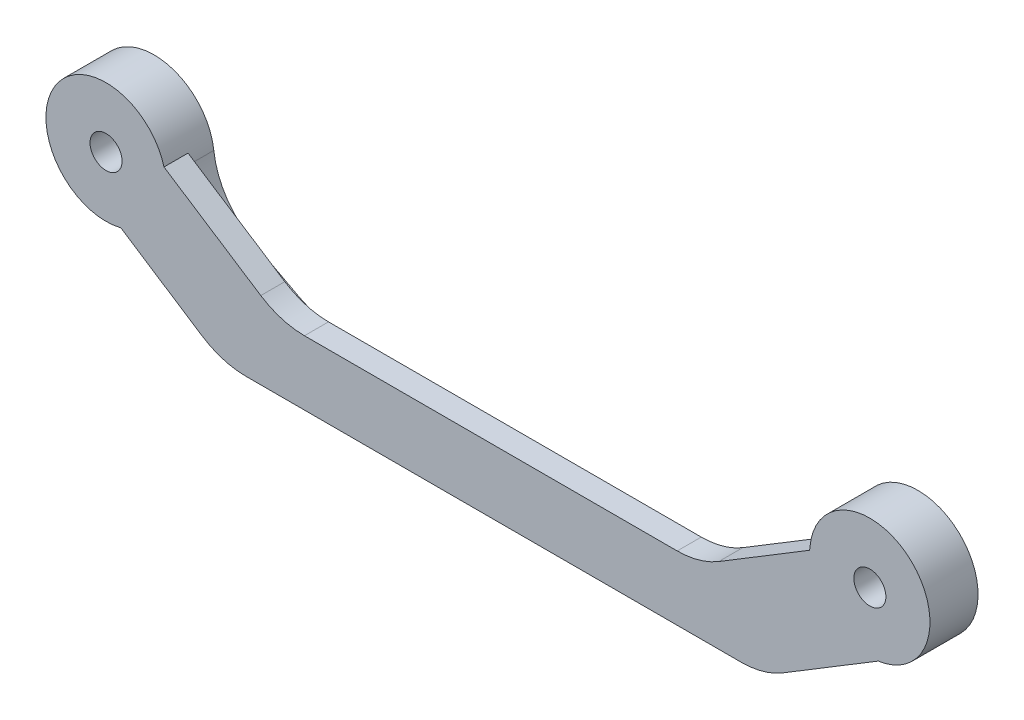
ISO-10303-21;
HEADER;
FILE_DESCRIPTION(('STEP AP214'),'2;1');
FILE_NAME('part.step','',(''),(''),'','','');
FILE_SCHEMA(('AUTOMOTIVE_DESIGN { 1 0 10303 214 1 1 1 1 }'));
ENDSEC;
DATA;
#1=APPLICATION_CONTEXT('core data for automotive mechanical design processes');
#2=APPLICATION_PROTOCOL_DEFINITION('international standard','automotive_design',2000,#1);
#3=PRODUCT_CONTEXT('',#1,'mechanical');
#4=PRODUCT('Part','Part','',(#3));
#5=PRODUCT_RELATED_PRODUCT_CATEGORY('part','',(#4));
#6=PRODUCT_DEFINITION_FORMATION('','',#4);
#7=PRODUCT_DEFINITION_CONTEXT('part definition',#1,'design');
#8=PRODUCT_DEFINITION('design','',#6,#7);
#9=PRODUCT_DEFINITION_SHAPE('','',#8);
#10=(LENGTH_UNIT() NAMED_UNIT(*) SI_UNIT(.MILLI.,.METRE.));
#11=(NAMED_UNIT(*) PLANE_ANGLE_UNIT() SI_UNIT($,.RADIAN.));
#12=(NAMED_UNIT(*) SI_UNIT($,.STERADIAN.) SOLID_ANGLE_UNIT());
#13=UNCERTAINTY_MEASURE_WITH_UNIT(LENGTH_MEASURE(1.E-05),#10,'distance_accuracy_value','');
#14=(GEOMETRIC_REPRESENTATION_CONTEXT(3) GLOBAL_UNCERTAINTY_ASSIGNED_CONTEXT((#13)) GLOBAL_UNIT_ASSIGNED_CONTEXT((#10,
#11,#12)) REPRESENTATION_CONTEXT('',''));
#15=CARTESIAN_POINT('',(0.,0.,0.));
#16=DIRECTION('',(0.,0.,1.));
#17=DIRECTION('',(1.,0.,0.));
#18=AXIS2_PLACEMENT_3D('',#15,#16,#17);
#19=CARTESIAN_POINT('',(0.,0.,0.));
#20=DIRECTION('',(0.,0.,1.));
#21=DIRECTION('',(1.,0.,0.));
#22=AXIS2_PLACEMENT_3D('',#19,#20,#21);
#23=PLANE('',#22);
#24=DIRECTION('',(-1.,0.,0.));
#25=VECTOR('',#24,1.);
#26=CARTESIAN_POINT('',(0.,-10.798154811245,0.));
#27=LINE('',#26,#25);
#28=CARTESIAN_POINT('',(72.4325503863458,-10.798154811245,0.));
#29=VERTEX_POINT('',#28);
#30=CARTESIAN_POINT('',(22.8152381583089,-10.798154811245,0.));
#31=VERTEX_POINT('',#30);
#32=EDGE_CURVE('E573',#29,#31,#27,.T.);
#33=ORIENTED_EDGE('',*,*,#32,.T.);
#34=CARTESIAN_POINT('',(22.8152381583089,-0.798154811245044,0.));
#35=DIRECTION('',(0.,0.,1.));
#36=DIRECTION('',(1.,0.,0.));
#37=AXIS2_PLACEMENT_3D('',#34,#35,#36);
#38=CIRCLE('',#37,10.);
#39=CARTESIAN_POINT('',(18.1232664163556,-9.62908914305338,0.));
#40=VERTEX_POINT('',#39);
#41=EDGE_CURVE('E387',#31,#40,#38,.F.);
#42=ORIENTED_EDGE('',*,*,#41,.T.);
#43=DIRECTION('',(-0.883093433180833,0.469197174195337,0.));
#44=VECTOR('',#43,1.);
#45=CARTESIAN_POINT('',(0.,0.,0.));
#46=LINE('',#45,#44);
#47=CARTESIAN_POINT('',(12.6824638741341,-6.73833140185933,0.));
#48=VERTEX_POINT('',#47);
#49=EDGE_CURVE('E567',#40,#48,#46,.T.);
#50=ORIENTED_EDGE('',*,*,#49,.T.);
#51=CARTESIAN_POINT('',(17.3744356160875,2.092602929949,0.));
#52=DIRECTION('',(0.,0.,1.));
#53=DIRECTION('',(1.,0.,0.));
#54=AXIS2_PLACEMENT_3D('',#51,#52,#53);
#55=CIRCLE('',#54,10.);
#56=CARTESIAN_POINT('',(7.44618669260892,0.896829827120999,0.));
#57=VERTEX_POINT('',#56);
#58=EDGE_CURVE('E286',#48,#57,#55,.F.);
#59=ORIENTED_EDGE('',*,*,#58,.T.);
#60=CARTESIAN_POINT('',(0.,0.,0.));
#61=DIRECTION('',(0.,0.,-1.));
#62=DIRECTION('',(-1.,0.,0.));
#63=AXIS2_PLACEMENT_3D('',#60,#61,#62);
#64=CIRCLE('',#63,7.5);
#65=CARTESIAN_POINT('',(7.22993331964056,1.9945085092702,0.));
#66=VERTEX_POINT('',#65);
#67=EDGE_CURVE('E252',#66,#57,#64,.T.);
#68=ORIENTED_EDGE('',*,*,#67,.F.);
#69=DIRECTION('',(0.838360945886254,-0.545115514742248,0.));
#70=VECTOR('',#69,1.);
#71=CARTESIAN_POINT('',(3.05987885568128,4.7059437171941,0.));
#72=LINE('',#71,#70);
#73=CARTESIAN_POINT('',(19.307973916843,-5.85882405533506,0.));
#74=VERTEX_POINT('',#73);
#75=EDGE_CURVE('E594',#66,#74,#72,.T.);
#76=ORIENTED_EDGE('',*,*,#75,.T.);
#77=CARTESIAN_POINT('',(24.7591290642655,2.52478540352748,0.));
#78=DIRECTION('',(0.,0.,1.));
#79=DIRECTION('',(1.,0.,0.));
#80=AXIS2_PLACEMENT_3D('',#77,#78,#79);
#81=CIRCLE('',#80,10.);
#82=CARTESIAN_POINT('',(24.7591290642655,-7.47521459647252,0.));
#83=VERTEX_POINT('',#82);
#84=EDGE_CURVE('E65',#74,#83,#81,.T.);
#85=ORIENTED_EDGE('',*,*,#84,.T.);
#86=DIRECTION('',(1.,0.,0.));
#87=VECTOR('',#86,1.);
#88=CARTESIAN_POINT('',(0.,-7.47521459647252,0.));
#89=LINE('',#88,#87);
#90=CARTESIAN_POINT('',(71.2682722322192,-7.47521459647252,0.));
#91=VERTEX_POINT('',#90);
#92=EDGE_CURVE('E619',#83,#91,#89,.T.);
#93=ORIENTED_EDGE('',*,*,#92,.T.);
#94=CARTESIAN_POINT('',(71.2682722322192,2.52478540352748,0.));
#95=DIRECTION('',(0.,0.,1.));
#96=DIRECTION('',(1.,0.,0.));
#97=AXIS2_PLACEMENT_3D('',#94,#95,#96);
#98=CIRCLE('',#97,10.);
#99=CARTESIAN_POINT('',(76.4587896796708,-6.0226427843955,0.));
#100=VERTEX_POINT('',#99);
#101=EDGE_CURVE('E57',#91,#100,#98,.T.);
#102=ORIENTED_EDGE('',*,*,#101,.T.);
#103=DIRECTION('',(0.8547428187923,0.519051744745159,0.));
#104=VECTOR('',#103,1.);
#105=CARTESIAN_POINT('',(23.2711030430952,-38.3214359894447,0.));
#106=LINE('',#105,#104);
#107=CARTESIAN_POINT('',(87.7880278038112,0.857158584719514,0.));
#108=VERTEX_POINT('',#107);
#109=EDGE_CURVE('E240',#100,#108,#106,.T.);
#110=ORIENTED_EDGE('',*,*,#109,.T.);
#111=CARTESIAN_POINT('',(77.8883178999931,2.26986655887549,0.));
#112=DIRECTION('',(0.,0.,1.));
#113=DIRECTION('',(1.,0.,0.));
#114=AXIS2_PLACEMENT_3D('',#111,#112,#113);
#115=CIRCLE('',#114,10.);
#116=CARTESIAN_POINT('',(82.7899012740973,-6.44646755740901,0.));
#117=VERTEX_POINT('',#116);
#118=EDGE_CURVE('E289',#108,#117,#115,.F.);
#119=ORIENTED_EDGE('',*,*,#118,.T.);
#120=DIRECTION('',(-0.87163341162845,-0.490158337410423,0.));
#121=VECTOR('',#120,1.);
#122=CARTESIAN_POINT('',(22.644882316251,-40.2686938541482,0.));
#123=LINE('',#122,#121);
#124=CARTESIAN_POINT('',(77.33413376045,-9.51448892752954,0.));
#125=VERTEX_POINT('',#124);
#126=EDGE_CURVE('E576',#117,#125,#123,.T.);
#127=ORIENTED_EDGE('',*,*,#126,.T.);
#128=CARTESIAN_POINT('',(72.4325503863458,-0.798154811245046,0.));
#129=DIRECTION('',(0.,0.,1.));
#130=DIRECTION('',(1.,0.,0.));
#131=AXIS2_PLACEMENT_3D('',#128,#129,#130);
#132=CIRCLE('',#131,10.);
#133=EDGE_CURVE('E384',#125,#29,#132,.F.);
#134=ORIENTED_EDGE('',*,*,#133,.T.);
#135=EDGE_LOOP('',(#33,#42,#50,#59,#68,#76,#85,#93,#102,#110,#119,#127,#134));
#136=FACE_BOUND('',#135,.T.);
#137=ADVANCED_FACE('F41',(#136),#23,.F.);
#138=DIRECTION('',(1.,0.,0.));
#139=VECTOR('',#138,1.);
#140=CARTESIAN_POINT('',(0.,-15.5109065068003,0.));
#141=LINE('',#140,#139);
#142=CARTESIAN_POINT('',(17.4575347319514,-15.5109065068003,0.));
#143=VERTEX_POINT('',#142);
#144=CARTESIAN_POINT('',(79.2698009548309,-15.5109065068003,0.));
#145=VERTEX_POINT('',#144);
#146=EDGE_CURVE('E241',#143,#145,#141,.T.);
#147=ORIENTED_EDGE('',*,*,#146,.F.);
#148=CARTESIAN_POINT('',(17.4575347319514,-5.5109065068003,0.));
#149=DIRECTION('',(0.,0.,1.));
#150=DIRECTION('',(1.,0.,0.));
#151=AXIS2_PLACEMENT_3D('',#148,#149,#150);
#152=CIRCLE('',#151,10.);
#153=CARTESIAN_POINT('',(11.9980146475645,-13.8890710103283,0.));
#154=VERTEX_POINT('',#153);
#155=EDGE_CURVE('E343',#143,#154,#152,.F.);
#156=ORIENTED_EDGE('',*,*,#155,.T.);
#157=DIRECTION('',(0.837816450352802,-0.545952008438683,0.));
#158=VECTOR('',#157,1.);
#159=CARTESIAN_POINT('',(-2.7767948878628,-4.26126179654545,0.));
#160=LINE('',#159,#158);
#161=CARTESIAN_POINT('',(1.84474832803201,-7.27282930604166,0.));
#162=VERTEX_POINT('',#161);
#163=EDGE_CURVE('E585',#162,#154,#160,.T.);
#164=ORIENTED_EDGE('',*,*,#163,.F.);
#165=CARTESIAN_POINT('',(3.93053466118942,-17.052885306516,0.));
#166=DIRECTION('',(0.,0.,1.));
#167=DIRECTION('',(1.,0.,0.));
#168=AXIS2_PLACEMENT_3D('',#165,#166,#167);
#169=CIRCLE('',#168,10.);
#170=CARTESIAN_POINT('',(8.62250640314279,-8.22195097470765,0.));
#171=VERTEX_POINT('',#170);
#172=EDGE_CURVE('E271',#162,#171,#169,.F.);
#173=ORIENTED_EDGE('',*,*,#172,.T.);
#174=DIRECTION('',(0.883093433180833,-0.469197174195337,0.));
#175=VECTOR('',#174,1.);
#176=CARTESIAN_POINT('',(-1.50851361773463,-2.83922952428249,0.));
#177=LINE('',#176,#175);
#178=CARTESIAN_POINT('',(16.6147527986209,-12.4683186673359,0.));
#179=VERTEX_POINT('',#178);
#180=EDGE_CURVE('E563',#171,#179,#177,.T.);
#181=ORIENTED_EDGE('',*,*,#180,.T.);
#182=CARTESIAN_POINT('',(21.3067245405743,-3.63738433552753,0.));
#183=DIRECTION('',(0.,0.,1.));
#184=DIRECTION('',(1.,0.,0.));
#185=AXIS2_PLACEMENT_3D('',#182,#183,#184);
#186=CIRCLE('',#185,10.);
#187=CARTESIAN_POINT('',(21.3067245405743,-13.6373843355275,0.));
#188=VERTEX_POINT('',#187);
#189=EDGE_CURVE('E413',#179,#188,#186,.T.);
#190=ORIENTED_EDGE('',*,*,#189,.T.);
#191=DIRECTION('',(1.,0.,0.));
#192=VECTOR('',#191,1.);
#193=CARTESIAN_POINT('',(0.,-13.6373843355275,0.));
#194=LINE('',#193,#192);
#195=CARTESIAN_POINT('',(74.0291757618564,-13.6373843355275,0.));
#196=VERTEX_POINT('',#195);
#197=EDGE_CURVE('E559',#188,#196,#194,.T.);
#198=ORIENTED_EDGE('',*,*,#197,.T.);
#199=CARTESIAN_POINT('',(74.0291757618564,-3.63738433552753,0.));
#200=DIRECTION('',(0.,0.,1.));
#201=DIRECTION('',(1.,0.,0.));
#202=AXIS2_PLACEMENT_3D('',#199,#200,#201);
#203=CIRCLE('',#202,10.);
#204=CARTESIAN_POINT('',(78.9307591359606,-12.353718451812,0.));
#205=VERTEX_POINT('',#204);
#206=EDGE_CURVE('E410',#196,#205,#203,.T.);
#207=ORIENTED_EDGE('',*,*,#206,.T.);
#208=DIRECTION('',(0.87163341162845,0.490158337410423,0.));
#209=VECTOR('',#208,1.);
#210=CARTESIAN_POINT('',(24.2415076917617,-43.1079233784307,0.));
#211=LINE('',#210,#209);
#212=CARTESIAN_POINT('',(86.9474614092907,-7.84556926272974,0.));
#213=VERTEX_POINT('',#212);
#214=EDGE_CURVE('E556',#205,#213,#211,.T.);
#215=ORIENTED_EDGE('',*,*,#214,.T.);
#216=CARTESIAN_POINT('',(91.8490447833949,-16.5619033790142,0.));
#217=DIRECTION('',(0.,0.,1.));
#218=DIRECTION('',(1.,0.,0.));
#219=AXIS2_PLACEMENT_3D('',#216,#217,#218);
#220=CIRCLE('',#219,10.);
#221=CARTESIAN_POINT('',(93.8254666893895,-6.75916108670112,0.));
#222=VERTEX_POINT('',#221);
#223=EDGE_CURVE('E248',#213,#222,#220,.F.);
#224=ORIENTED_EDGE('',*,*,#223,.T.);
#225=CARTESIAN_POINT('',(95.3077831188855,0.592895632533732,0.));
#226=DIRECTION('',(0.,0.,-1.));
#227=DIRECTION('',(-1.,0.,0.));
#228=AXIS2_PLACEMENT_3D('',#225,#226,#227);
#229=CIRCLE('',#228,7.5);
#230=CARTESIAN_POINT('',(96.3582789784704,-6.83317051644414,0.));
#231=VERTEX_POINT('',#230);
#232=EDGE_CURVE('E244',#231,#222,#229,.T.);
#233=ORIENTED_EDGE('',*,*,#232,.F.);
#234=DIRECTION('',(0.8547428187923,0.519051744745159,0.));
#235=VECTOR('',#234,1.);
#236=CARTESIAN_POINT('',(28.9919135457597,-47.7421185019847,0.));
#237=LINE('',#236,#235);
#238=CARTESIAN_POINT('',(84.4603184022824,-14.0583346947233,0.));
#239=VERTEX_POINT('',#238);
#240=EDGE_CURVE('E229',#239,#231,#237,.T.);
#241=ORIENTED_EDGE('',*,*,#240,.F.);
#242=CARTESIAN_POINT('',(79.2698009548309,-5.5109065068003,0.));
#243=DIRECTION('',(0.,0.,1.));
#244=DIRECTION('',(1.,0.,0.));
#245=AXIS2_PLACEMENT_3D('',#242,#243,#244);
#246=CIRCLE('',#245,10.);
#247=EDGE_CURVE('E340',#239,#145,#246,.F.);
#248=ORIENTED_EDGE('',*,*,#247,.T.);
#249=EDGE_LOOP('',(#147,#156,#164,#173,#181,#190,#198,#207,#215,#224,#233,#241,#248));
#250=FACE_BOUND('',#249,.T.);
#251=ADVANCED_FACE('F246',(#250),#23,.F.);
#252=CARTESIAN_POINT('',(0.,0.,3.));
#253=DIRECTION('',(0.,0.,-1.));
#254=DIRECTION('',(-1.,0.,0.));
#255=AXIS2_PLACEMENT_3D('',#252,#253,#254);
#256=CYLINDRICAL_SURFACE('',#255,7.5);
#257=CARTESIAN_POINT('',(0.,0.,-3.));
#258=DIRECTION('',(0.,0.,-1.));
#259=DIRECTION('',(-1.,0.,0.));
#260=AXIS2_PLACEMENT_3D('',#257,#258,#259);
#261=CIRCLE('',#260,7.5);
#262=CARTESIAN_POINT('',(1.68451485479547,-7.30837941707828,-3.));
#263=VERTEX_POINT('',#262);
#264=CARTESIAN_POINT('',(7.44618669260892,0.896829827120999,-3.));
#265=VERTEX_POINT('',#264);
#266=EDGE_CURVE('E548',#263,#265,#261,.T.);
#267=ORIENTED_EDGE('',*,*,#266,.F.);
#268=DIRECTION('',(0.,0.,-1.));
#269=VECTOR('',#268,1.);
#270=CARTESIAN_POINT('',(1.68451485479547,-7.30837941707828,3.));
#271=LINE('',#270,#269);
#272=CARTESIAN_POINT('',(1.68451485479547,-7.30837941707828,3.));
#273=VERTEX_POINT('',#272);
#274=EDGE_CURVE('E298',#263,#273,#271,.F.);
#275=ORIENTED_EDGE('',*,*,#274,.T.);
#276=CARTESIAN_POINT('',(0.,0.,3.));
#277=DIRECTION('',(0.,0.,1.));
#278=DIRECTION('',(1.,0.,0.));
#279=AXIS2_PLACEMENT_3D('',#276,#277,#278);
#280=CIRCLE('',#279,7.5);
#281=CARTESIAN_POINT('',(7.22993331964056,1.9945085092702,3.));
#282=VERTEX_POINT('',#281);
#283=EDGE_CURVE('E589',#282,#273,#280,.T.);
#284=ORIENTED_EDGE('',*,*,#283,.F.);
#285=DIRECTION('',(0.,0.,-1.));
#286=VECTOR('',#285,1.);
#287=CARTESIAN_POINT('',(7.22993331964056,1.9945085092702,3.));
#288=LINE('',#287,#286);
#289=EDGE_CURVE('E259',#282,#66,#288,.T.);
#290=ORIENTED_EDGE('',*,*,#289,.T.);
#291=ORIENTED_EDGE('',*,*,#67,.T.);
#292=DIRECTION('',(0.,0.,-1.));
#293=VECTOR('',#292,1.);
#294=CARTESIAN_POINT('',(7.44618669260892,0.896829827120999,3.));
#295=LINE('',#294,#293);
#296=EDGE_CURVE('E295',#57,#265,#295,.T.);
#297=ORIENTED_EDGE('',*,*,#296,.T.);
#298=EDGE_LOOP('',(#267,#275,#284,#290,#291,#297));
#299=FACE_BOUND('',#298,.T.);
#300=ADVANCED_FACE('F457',(#299),#256,.T.);
#301=CARTESIAN_POINT('',(-2.7767948878628,-4.26126179654545,3.));
#302=DIRECTION('',(0.545952008438683,0.837816450352802,0.));
#303=DIRECTION('',(-0.837816450352802,0.545952008438683,0.));
#304=AXIS2_PLACEMENT_3D('',#301,#302,#303);
#305=PLANE('',#304);
#306=ORIENTED_EDGE('',*,*,#163,.T.);
#307=DIRECTION('',(0.,0.,-1.));
#308=VECTOR('',#307,1.);
#309=CARTESIAN_POINT('',(11.9980146475645,-13.8890710103283,3.));
#310=LINE('',#309,#308);
#311=CARTESIAN_POINT('',(11.9980146475645,-13.8890710103283,3.));
#312=VERTEX_POINT('',#311);
#313=EDGE_CURVE('E346',#154,#312,#310,.F.);
#314=ORIENTED_EDGE('',*,*,#313,.T.);
#315=DIRECTION('',(0.837816450352802,-0.545952008438683,0.));
#316=VECTOR('',#315,1.);
#317=CARTESIAN_POINT('',(-2.7767948878628,-4.26126179654545,3.));
#318=LINE('',#317,#316);
#319=CARTESIAN_POINT('',(1.84474832803201,-7.27282930604166,3.));
#320=VERTEX_POINT('',#319);
#321=EDGE_CURVE('E593',#320,#312,#318,.T.);
#322=ORIENTED_EDGE('',*,*,#321,.F.);
#323=DIRECTION('',(0.,0.,-1.));
#324=VECTOR('',#323,1.);
#325=CARTESIAN_POINT('',(1.84474832803201,-7.27282930604166,3.));
#326=LINE('',#325,#324);
#327=EDGE_CURVE('E302',#320,#162,#326,.T.);
#328=ORIENTED_EDGE('',*,*,#327,.T.);
#329=EDGE_LOOP('',(#306,#314,#322,#328));
#330=FACE_BOUND('',#329,.T.);
#331=ADVANCED_FACE('F479',(#330),#305,.F.);
#332=CARTESIAN_POINT('',(0.,-15.5109065068003,3.));
#333=DIRECTION('',(0.,1.,0.));
#334=DIRECTION('',(0.,0.,1.));
#335=AXIS2_PLACEMENT_3D('',#332,#333,#334);
#336=PLANE('',#335);
#337=DIRECTION('',(1.,0.,0.));
#338=VECTOR('',#337,1.);
#339=CARTESIAN_POINT('',(0.,-15.5109065068003,3.));
#340=LINE('',#339,#338);
#341=CARTESIAN_POINT('',(17.4575347319514,-15.5109065068003,3.));
#342=VERTEX_POINT('',#341);
#343=CARTESIAN_POINT('',(79.2698009548309,-15.5109065068003,3.));
#344=VERTEX_POINT('',#343);
#345=EDGE_CURVE('E597',#342,#344,#340,.T.);
#346=ORIENTED_EDGE('',*,*,#345,.F.);
#347=DIRECTION('',(0.,0.,-1.));
#348=VECTOR('',#347,1.);
#349=CARTESIAN_POINT('',(17.4575347319514,-15.5109065068003,3.));
#350=LINE('',#349,#348);
#351=EDGE_CURVE('E336',#342,#143,#350,.T.);
#352=ORIENTED_EDGE('',*,*,#351,.T.);
#353=ORIENTED_EDGE('',*,*,#146,.T.);
#354=DIRECTION('',(0.,0.,-1.));
#355=VECTOR('',#354,1.);
#356=CARTESIAN_POINT('',(79.2698009548309,-15.5109065068003,3.));
#357=LINE('',#356,#355);
#358=EDGE_CURVE('E333',#145,#344,#357,.F.);
#359=ORIENTED_EDGE('',*,*,#358,.T.);
#360=EDGE_LOOP('',(#346,#352,#353,#359));
#361=FACE_BOUND('',#360,.T.);
#362=ADVANCED_FACE('F476',(#361),#336,.F.);
#363=CARTESIAN_POINT('',(28.9919135457597,-47.7421185019847,3.));
#364=DIRECTION('',(-0.519051744745159,0.8547428187923,0.));
#365=DIRECTION('',(-0.8547428187923,-0.519051744745159,0.));
#366=AXIS2_PLACEMENT_3D('',#363,#364,#365);
#367=PLANE('',#366);
#368=DIRECTION('',(0.8547428187923,0.519051744745159,0.));
#369=VECTOR('',#368,1.);
#370=CARTESIAN_POINT('',(28.9919135457597,-47.7421185019847,3.));
#371=LINE('',#370,#369);
#372=CARTESIAN_POINT('',(84.4603184022824,-14.0583346947233,3.));
#373=VERTEX_POINT('',#372);
#374=CARTESIAN_POINT('',(96.3582789784704,-6.83317051644413,3.));
#375=VERTEX_POINT('',#374);
#376=EDGE_CURVE('E601',#373,#375,#371,.T.);
#377=ORIENTED_EDGE('',*,*,#376,.F.);
#378=DIRECTION('',(0.,0.,-1.));
#379=VECTOR('',#378,1.);
#380=CARTESIAN_POINT('',(84.4603184022824,-14.0583346947233,3.));
#381=LINE('',#380,#379);
#382=EDGE_CURVE('E237',#373,#239,#381,.T.);
#383=ORIENTED_EDGE('',*,*,#382,.T.);
#384=ORIENTED_EDGE('',*,*,#240,.T.);
#385=DIRECTION('',(0.,0.,-1.));
#386=VECTOR('',#385,1.);
#387=CARTESIAN_POINT('',(96.3582789784704,-6.83317051644413,3.));
#388=LINE('',#387,#386);
#389=EDGE_CURVE('E234',#375,#231,#388,.T.);
#390=ORIENTED_EDGE('',*,*,#389,.F.);
#391=EDGE_LOOP('',(#377,#383,#384,#390));
#392=FACE_BOUND('',#391,.T.);
#393=ADVANCED_FACE('F232',(#392),#367,.F.);
#394=CARTESIAN_POINT('',(95.3077831188855,0.592895632533732,3.));
#395=DIRECTION('',(0.,0.,-1.));
#396=DIRECTION('',(-1.,0.,0.));
#397=AXIS2_PLACEMENT_3D('',#394,#395,#396);
#398=CYLINDRICAL_SURFACE('',#397,7.5);
#399=ORIENTED_EDGE('',*,*,#232,.T.);
#400=DIRECTION('',(0.,0.,-1.));
#401=VECTOR('',#400,1.);
#402=CARTESIAN_POINT('',(93.8254666893895,-6.75916108670112,3.));
#403=LINE('',#402,#401);
#404=CARTESIAN_POINT('',(93.8254666893895,-6.75916108670112,-3.));
#405=VERTEX_POINT('',#404);
#406=EDGE_CURVE('E279',#222,#405,#403,.T.);
#407=ORIENTED_EDGE('',*,*,#406,.T.);
#408=CARTESIAN_POINT('',(95.3077831188855,0.592895632533732,-3.));
#409=DIRECTION('',(0.,0.,-1.));
#410=DIRECTION('',(-1.,0.,0.));
#411=AXIS2_PLACEMENT_3D('',#408,#409,#410);
#412=CIRCLE('',#411,7.5);
#413=CARTESIAN_POINT('',(87.8422980250745,1.31159745810877,-3.));
#414=VERTEX_POINT('',#413);
#415=EDGE_CURVE('E655',#414,#405,#412,.T.);
#416=ORIENTED_EDGE('',*,*,#415,.F.);
#417=DIRECTION('',(0.,0.,-1.));
#418=VECTOR('',#417,1.);
#419=CARTESIAN_POINT('',(87.8422980250745,1.31159745810877,3.));
#420=LINE('',#419,#418);
#421=CARTESIAN_POINT('',(87.8422980250745,1.31159745810877,3.));
#422=VERTEX_POINT('',#421);
#423=EDGE_CURVE('E276',#414,#422,#420,.F.);
#424=ORIENTED_EDGE('',*,*,#423,.T.);
#425=CARTESIAN_POINT('',(95.3077831188855,0.592895632533732,3.));
#426=DIRECTION('',(0.,0.,1.));
#427=DIRECTION('',(1.,0.,0.));
#428=AXIS2_PLACEMENT_3D('',#425,#426,#427);
#429=CIRCLE('',#428,7.5);
#430=EDGE_CURVE('E257',#375,#422,#429,.T.);
#431=ORIENTED_EDGE('',*,*,#430,.F.);
#432=ORIENTED_EDGE('',*,*,#389,.T.);
#433=EDGE_LOOP('',(#399,#407,#416,#424,#431,#432));
#434=FACE_BOUND('',#433,.T.);
#435=ADVANCED_FACE('F254',(#434),#398,.T.);
#436=CARTESIAN_POINT('',(23.2711030430952,-38.3214359894447,3.));
#437=DIRECTION('',(-0.519051744745159,0.8547428187923,0.));
#438=DIRECTION('',(-0.8547428187923,-0.519051744745159,0.));
#439=AXIS2_PLACEMENT_3D('',#436,#437,#438);
#440=PLANE('',#439);
#441=ORIENTED_EDGE('',*,*,#109,.F.);
#442=DIRECTION('',(0.,0.,-1.));
#443=VECTOR('',#442,1.);
#444=CARTESIAN_POINT('',(76.4587896796707,-6.02264278439552,3.));
#445=LINE('',#444,#443);
#446=CARTESIAN_POINT('',(76.4587896796708,-6.0226427843955,3.));
#447=VERTEX_POINT('',#446);
#448=EDGE_CURVE('E403',#100,#447,#445,.F.);
#449=ORIENTED_EDGE('',*,*,#448,.T.);
#450=DIRECTION('',(0.8547428187923,0.519051744745159,0.));
#451=VECTOR('',#450,1.);
#452=CARTESIAN_POINT('',(23.2711030430952,-38.3214359894447,3.));
#453=LINE('',#452,#451);
#454=CARTESIAN_POINT('',(87.7880278038113,0.85715858471952,3.));
#455=VERTEX_POINT('',#454);
#456=EDGE_CURVE('E435',#447,#455,#453,.T.);
#457=ORIENTED_EDGE('',*,*,#456,.T.);
#458=DIRECTION('',(0.,0.,-1.));
#459=VECTOR('',#458,1.);
#460=CARTESIAN_POINT('',(87.7880278038112,0.857158584719519,3.));
#461=LINE('',#460,#459);
#462=EDGE_CURVE('E282',#455,#108,#461,.T.);
#463=ORIENTED_EDGE('',*,*,#462,.T.);
#464=EDGE_LOOP('',(#441,#449,#457,#463));
#465=FACE_BOUND('',#464,.T.);
#466=ADVANCED_FACE('F468',(#465),#440,.T.);
#467=CARTESIAN_POINT('',(0.,-7.47521459647252,3.));
#468=DIRECTION('',(0.,1.,0.));
#469=DIRECTION('',(0.,0.,1.));
#470=AXIS2_PLACEMENT_3D('',#467,#468,#469);
#471=PLANE('',#470);
#472=ORIENTED_EDGE('',*,*,#92,.F.);
#473=DIRECTION('',(0.,0.,-1.));
#474=VECTOR('',#473,1.);
#475=CARTESIAN_POINT('',(24.7591290642655,-7.47521459647252,3.));
#476=LINE('',#475,#474);
#477=CARTESIAN_POINT('',(24.7591290642655,-7.47521459647252,3.));
#478=VERTEX_POINT('',#477);
#479=EDGE_CURVE('E400',#83,#478,#476,.F.);
#480=ORIENTED_EDGE('',*,*,#479,.T.);
#481=DIRECTION('',(1.,0.,0.));
#482=VECTOR('',#481,1.);
#483=CARTESIAN_POINT('',(0.,-7.47521459647252,3.));
#484=LINE('',#483,#482);
#485=CARTESIAN_POINT('',(71.2682722322192,-7.47521459647252,3.));
#486=VERTEX_POINT('',#485);
#487=EDGE_CURVE('E433',#478,#486,#484,.T.);
#488=ORIENTED_EDGE('',*,*,#487,.T.);
#489=DIRECTION('',(0.,0.,-1.));
#490=VECTOR('',#489,1.);
#491=CARTESIAN_POINT('',(71.2682722322192,-7.47521459647252,0.));
#492=LINE('',#491,#490);
#493=EDGE_CURVE('E397',#486,#91,#492,.T.);
#494=ORIENTED_EDGE('',*,*,#493,.T.);
#495=EDGE_LOOP('',(#472,#480,#488,#494));
#496=FACE_BOUND('',#495,.T.);
#497=ADVANCED_FACE('F437',(#496),#471,.T.);
#498=CARTESIAN_POINT('',(3.05987885568128,4.7059437171941,3.));
#499=DIRECTION('',(0.545115514742248,0.838360945886254,0.));
#500=DIRECTION('',(-0.838360945886254,0.545115514742248,0.));
#501=AXIS2_PLACEMENT_3D('',#498,#499,#500);
#502=PLANE('',#501);
#503=DIRECTION('',(0.838360945886254,-0.545115514742248,0.));
#504=VECTOR('',#503,1.);
#505=CARTESIAN_POINT('',(3.05987885568128,4.7059437171941,3.));
#506=LINE('',#505,#504);
#507=CARTESIAN_POINT('',(19.307973916843,-5.85882405533506,3.));
#508=VERTEX_POINT('',#507);
#509=EDGE_CURVE('E263',#282,#508,#506,.T.);
#510=ORIENTED_EDGE('',*,*,#509,.T.);
#511=DIRECTION('',(0.,0.,-1.));
#512=VECTOR('',#511,1.);
#513=CARTESIAN_POINT('',(19.307973916843,-5.85882405533506,0.));
#514=LINE('',#513,#512);
#515=EDGE_CURVE('E393',#508,#74,#514,.T.);
#516=ORIENTED_EDGE('',*,*,#515,.T.);
#517=ORIENTED_EDGE('',*,*,#75,.F.);
#518=ORIENTED_EDGE('',*,*,#289,.F.);
#519=EDGE_LOOP('',(#510,#516,#517,#518));
#520=FACE_BOUND('',#519,.T.);
#521=ADVANCED_FACE('F462',(#520),#502,.T.);
#522=CARTESIAN_POINT('',(0.,0.,3.));
#523=DIRECTION('',(0.,0.,1.));
#524=DIRECTION('',(1.,0.,0.));
#525=AXIS2_PLACEMENT_3D('',#522,#523,#524);
#526=PLANE('',#525);
#527=CARTESIAN_POINT('',(0.,0.,3.));
#528=DIRECTION('',(0.,0.,1.));
#529=DIRECTION('',(1.,0.,0.));
#530=AXIS2_PLACEMENT_3D('',#527,#528,#529);
#531=CIRCLE('',#530,2.);
#532=CARTESIAN_POINT('',(2.,0.,3.));
#533=VERTEX_POINT('',#532);
#534=EDGE_CURVE('E581',#533,#533,#531,.T.);
#535=ORIENTED_EDGE('',*,*,#534,.F.);
#536=EDGE_LOOP('',(#535));
#537=FACE_BOUND('',#536,.T.);
#538=CARTESIAN_POINT('',(95.3077831188855,0.592895632533732,3.));
#539=DIRECTION('',(0.,0.,1.));
#540=DIRECTION('',(1.,0.,0.));
#541=AXIS2_PLACEMENT_3D('',#538,#539,#540);
#542=CIRCLE('',#541,2.);
#543=CARTESIAN_POINT('',(97.3077831188855,0.592895632533732,3.));
#544=VERTEX_POINT('',#543);
#545=EDGE_CURVE('E554',#544,#544,#542,.T.);
#546=ORIENTED_EDGE('',*,*,#545,.F.);
#547=EDGE_LOOP('',(#546));
#548=FACE_BOUND('',#547,.T.);
#549=ORIENTED_EDGE('',*,*,#321,.T.);
#550=CARTESIAN_POINT('',(17.4575347319514,-5.5109065068003,3.));
#551=DIRECTION('',(0.,0.,1.));
#552=DIRECTION('',(1.,0.,0.));
#553=AXIS2_PLACEMENT_3D('',#550,#551,#552);
#554=CIRCLE('',#553,10.);
#555=EDGE_CURVE('E352',#312,#342,#554,.T.);
#556=ORIENTED_EDGE('',*,*,#555,.T.);
#557=ORIENTED_EDGE('',*,*,#345,.T.);
#558=CARTESIAN_POINT('',(79.2698009548309,-5.5109065068003,3.));
#559=DIRECTION('',(0.,0.,1.));
#560=DIRECTION('',(1.,0.,0.));
#561=AXIS2_PLACEMENT_3D('',#558,#559,#560);
#562=CIRCLE('',#561,10.);
#563=EDGE_CURVE('E349',#344,#373,#562,.T.);
#564=ORIENTED_EDGE('',*,*,#563,.T.);
#565=ORIENTED_EDGE('',*,*,#376,.T.);
#566=ORIENTED_EDGE('',*,*,#430,.T.);
#567=CARTESIAN_POINT('',(77.8883178999931,2.26986655887549,3.));
#568=DIRECTION('',(0.,0.,1.));
#569=DIRECTION('',(1.,0.,0.));
#570=AXIS2_PLACEMENT_3D('',#567,#568,#569);
#571=CIRCLE('',#570,10.);
#572=EDGE_CURVE('E316',#422,#455,#571,.F.);
#573=ORIENTED_EDGE('',*,*,#572,.T.);
#574=ORIENTED_EDGE('',*,*,#456,.F.);
#575=CARTESIAN_POINT('',(71.2682722322192,2.52478540352748,3.));
#576=DIRECTION('',(0.,0.,1.));
#577=DIRECTION('',(1.,0.,0.));
#578=AXIS2_PLACEMENT_3D('',#575,#576,#577);
#579=CIRCLE('',#578,10.);
#580=EDGE_CURVE('E50',#447,#486,#579,.F.);
#581=ORIENTED_EDGE('',*,*,#580,.T.);
#582=ORIENTED_EDGE('',*,*,#487,.F.);
#583=CARTESIAN_POINT('',(24.7591290642655,2.52478540352748,3.));
#584=DIRECTION('',(0.,0.,1.));
#585=DIRECTION('',(1.,0.,0.));
#586=AXIS2_PLACEMENT_3D('',#583,#584,#585);
#587=CIRCLE('',#586,10.);
#588=EDGE_CURVE('E421',#478,#508,#587,.F.);
#589=ORIENTED_EDGE('',*,*,#588,.T.);
#590=ORIENTED_EDGE('',*,*,#509,.F.);
#591=ORIENTED_EDGE('',*,*,#283,.T.);
#592=CARTESIAN_POINT('',(3.93053466118942,-17.052885306516,3.));
#593=DIRECTION('',(0.,0.,1.));
#594=DIRECTION('',(1.,0.,0.));
#595=AXIS2_PLACEMENT_3D('',#592,#593,#594);
#596=CIRCLE('',#595,10.);
#597=EDGE_CURVE('E323',#273,#320,#596,.F.);
#598=ORIENTED_EDGE('',*,*,#597,.T.);
#599=EDGE_LOOP('',(#549,#556,#557,#564,#565,#566,#573,#574,#581,#582,#589,#590,#591,#598));
#600=FACE_BOUND('',#599,.T.);
#601=ADVANCED_FACE('F432',(#537,#548,#600),#526,.T.);
#602=CARTESIAN_POINT('',(95.3077831188855,0.592895632533732,0.));
#603=DIRECTION('',(0.,0.,1.));
#604=DIRECTION('',(1.,0.,0.));
#605=AXIS2_PLACEMENT_3D('',#602,#603,#604);
#606=CYLINDRICAL_SURFACE('',#605,2.);
#607=ORIENTED_EDGE('',*,*,#545,.T.);
#608=EDGE_LOOP('',(#607));
#609=FACE_BOUND('',#608,.T.);
#610=CARTESIAN_POINT('',(95.3077831188855,0.592895632533732,-3.));
#611=DIRECTION('',(0.,0.,-1.));
#612=DIRECTION('',(-1.,0.,0.));
#613=AXIS2_PLACEMENT_3D('',#610,#611,#612);
#614=CIRCLE('',#613,2.);
#615=CARTESIAN_POINT('',(93.3077831188855,0.592895632533732,-3.));
#616=VERTEX_POINT('',#615);
#617=EDGE_CURVE('E580',#616,#616,#614,.F.);
#618=ORIENTED_EDGE('',*,*,#617,.F.);
#619=EDGE_LOOP('',(#618));
#620=FACE_BOUND('',#619,.T.);
#621=ADVANCED_FACE('F704',(#609,#620),#606,.F.);
#622=CARTESIAN_POINT('',(0.,0.,0.));
#623=DIRECTION('',(0.,0.,1.));
#624=DIRECTION('',(1.,0.,0.));
#625=AXIS2_PLACEMENT_3D('',#622,#623,#624);
#626=CYLINDRICAL_SURFACE('',#625,2.);
#627=ORIENTED_EDGE('',*,*,#534,.T.);
#628=EDGE_LOOP('',(#627));
#629=FACE_BOUND('',#628,.T.);
#630=CARTESIAN_POINT('',(0.,0.,-3.));
#631=DIRECTION('',(0.,0.,-1.));
#632=DIRECTION('',(-1.,0.,0.));
#633=AXIS2_PLACEMENT_3D('',#630,#631,#632);
#634=CIRCLE('',#633,2.);
#635=CARTESIAN_POINT('',(-2.,0.,-3.));
#636=VERTEX_POINT('',#635);
#637=EDGE_CURVE('E546',#636,#636,#634,.F.);
#638=ORIENTED_EDGE('',*,*,#637,.F.);
#639=EDGE_LOOP('',(#638));
#640=FACE_BOUND('',#639,.T.);
#641=ADVANCED_FACE('F701',(#629,#640),#626,.F.);
#642=CARTESIAN_POINT('',(24.2415076917617,-43.1079233784307,-3.));
#643=DIRECTION('',(0.490158337410423,-0.871633411628449,0.));
#644=DIRECTION('',(0.87163341162845,0.490158337410423,0.));
#645=AXIS2_PLACEMENT_3D('',#642,#643,#644);
#646=PLANE('',#645);
#647=ORIENTED_EDGE('',*,*,#214,.F.);
#648=DIRECTION('',(0.,0.,1.));
#649=VECTOR('',#648,1.);
#650=CARTESIAN_POINT('',(78.9307591359606,-12.353718451812,-3.));
#651=LINE('',#650,#649);
#652=CARTESIAN_POINT('',(78.9307591359606,-12.353718451812,-3.));
#653=VERTEX_POINT('',#652);
#654=EDGE_CURVE('E364',#205,#653,#651,.F.);
#655=ORIENTED_EDGE('',*,*,#654,.T.);
#656=DIRECTION('',(0.87163341162845,0.490158337410423,0.));
#657=VECTOR('',#656,1.);
#658=CARTESIAN_POINT('',(24.2415076917617,-43.1079233784307,-3.));
#659=LINE('',#658,#657);
#660=CARTESIAN_POINT('',(86.9474614092907,-7.84556926272974,-3.));
#661=VERTEX_POINT('',#660);
#662=EDGE_CURVE('E658',#653,#661,#659,.T.);
#663=ORIENTED_EDGE('',*,*,#662,.T.);
#664=DIRECTION('',(0.,0.,-1.));
#665=VECTOR('',#664,1.);
#666=CARTESIAN_POINT('',(86.9474614092907,-7.84556926272975,-3.));
#667=LINE('',#666,#665);
#668=EDGE_CURVE('E267',#661,#213,#667,.F.);
#669=ORIENTED_EDGE('',*,*,#668,.T.);
#670=EDGE_LOOP('',(#647,#655,#663,#669));
#671=FACE_BOUND('',#670,.T.);
#672=ADVANCED_FACE('F697',(#671),#646,.T.);
#673=CARTESIAN_POINT('',(0.,-13.6373843355275,-3.));
#674=DIRECTION('',(0.,-1.,0.));
#675=DIRECTION('',(0.,0.,-1.));
#676=AXIS2_PLACEMENT_3D('',#673,#674,#675);
#677=PLANE('',#676);
#678=DIRECTION('',(1.,0.,0.));
#679=VECTOR('',#678,1.);
#680=CARTESIAN_POINT('',(0.,-13.6373843355275,-3.));
#681=LINE('',#680,#679);
#682=CARTESIAN_POINT('',(21.3067245405743,-13.6373843355275,-3.));
#683=VERTEX_POINT('',#682);
#684=CARTESIAN_POINT('',(74.0291757618564,-13.6373843355275,-3.));
#685=VERTEX_POINT('',#684);
#686=EDGE_CURVE('E662',#683,#685,#681,.T.);
#687=ORIENTED_EDGE('',*,*,#686,.T.);
#688=DIRECTION('',(0.,0.,1.));
#689=VECTOR('',#688,1.);
#690=CARTESIAN_POINT('',(74.0291757618564,-13.6373843355275,-3.));
#691=LINE('',#690,#689);
#692=EDGE_CURVE('E360',#685,#196,#691,.T.);
#693=ORIENTED_EDGE('',*,*,#692,.T.);
#694=ORIENTED_EDGE('',*,*,#197,.F.);
#695=DIRECTION('',(0.,0.,1.));
#696=VECTOR('',#695,1.);
#697=CARTESIAN_POINT('',(21.3067245405743,-13.6373843355275,-3.));
#698=LINE('',#697,#696);
#699=EDGE_CURVE('E357',#188,#683,#698,.F.);
#700=ORIENTED_EDGE('',*,*,#699,.T.);
#701=EDGE_LOOP('',(#687,#693,#694,#700));
#702=FACE_BOUND('',#701,.T.);
#703=ADVANCED_FACE('F690',(#702),#677,.T.);
#704=CARTESIAN_POINT('',(-1.50851361773463,-2.83922952428249,-3.));
#705=DIRECTION('',(-0.469197174195337,-0.883093433180833,0.));
#706=DIRECTION('',(0.883093433180833,-0.469197174195337,0.));
#707=AXIS2_PLACEMENT_3D('',#704,#705,#706);
#708=PLANE('',#707);
#709=DIRECTION('',(0.883093433180833,-0.469197174195337,0.));
#710=VECTOR('',#709,1.);
#711=CARTESIAN_POINT('',(-1.50851361773463,-2.83922952428249,-3.));
#712=LINE('',#711,#710);
#713=CARTESIAN_POINT('',(8.62250640314279,-8.22195097470765,-3.));
#714=VERTEX_POINT('',#713);
#715=CARTESIAN_POINT('',(16.6147527986209,-12.4683186673359,-3.));
#716=VERTEX_POINT('',#715);
#717=EDGE_CURVE('E670',#714,#716,#712,.T.);
#718=ORIENTED_EDGE('',*,*,#717,.T.);
#719=DIRECTION('',(0.,0.,1.));
#720=VECTOR('',#719,1.);
#721=CARTESIAN_POINT('',(16.6147527986209,-12.4683186673359,-3.));
#722=LINE('',#721,#720);
#723=EDGE_CURVE('E373',#716,#179,#722,.T.);
#724=ORIENTED_EDGE('',*,*,#723,.T.);
#725=ORIENTED_EDGE('',*,*,#180,.F.);
#726=DIRECTION('',(0.,0.,-1.));
#727=VECTOR('',#726,1.);
#728=CARTESIAN_POINT('',(8.62250640314279,-8.22195097470765,-3.));
#729=LINE('',#728,#727);
#730=EDGE_CURVE('E305',#171,#714,#729,.T.);
#731=ORIENTED_EDGE('',*,*,#730,.T.);
#732=EDGE_LOOP('',(#718,#724,#725,#731));
#733=FACE_BOUND('',#732,.T.);
#734=ADVANCED_FACE('F683',(#733),#708,.T.);
#735=CARTESIAN_POINT('',(0.,0.,-3.));
#736=DIRECTION('',(0.469197174195337,0.883093433180833,0.));
#737=DIRECTION('',(-0.883093433180833,0.469197174195337,0.));
#738=AXIS2_PLACEMENT_3D('',#735,#736,#737);
#739=PLANE('',#738);
#740=ORIENTED_EDGE('',*,*,#49,.F.);
#741=DIRECTION('',(0.,0.,1.));
#742=VECTOR('',#741,1.);
#743=CARTESIAN_POINT('',(18.1232664163556,-9.62908914305337,-3.));
#744=LINE('',#743,#742);
#745=CARTESIAN_POINT('',(18.1232664163556,-9.62908914305338,-3.));
#746=VERTEX_POINT('',#745);
#747=EDGE_CURVE('E390',#40,#746,#744,.F.);
#748=ORIENTED_EDGE('',*,*,#747,.T.);
#749=DIRECTION('',(-0.883093433180833,0.469197174195337,0.));
#750=VECTOR('',#749,1.);
#751=CARTESIAN_POINT('',(0.,0.,-3.));
#752=LINE('',#751,#750);
#753=CARTESIAN_POINT('',(12.6824638741341,-6.73833140185933,-3.));
#754=VERTEX_POINT('',#753);
#755=EDGE_CURVE('E535',#746,#754,#752,.T.);
#756=ORIENTED_EDGE('',*,*,#755,.T.);
#757=DIRECTION('',(0.,0.,-1.));
#758=VECTOR('',#757,1.);
#759=CARTESIAN_POINT('',(12.6824638741341,-6.73833140185933,-3.));
#760=LINE('',#759,#758);
#761=EDGE_CURVE('E308',#754,#48,#760,.F.);
#762=ORIENTED_EDGE('',*,*,#761,.T.);
#763=EDGE_LOOP('',(#740,#748,#756,#762));
#764=FACE_BOUND('',#763,.T.);
#765=ADVANCED_FACE('F681',(#764),#739,.T.);
#766=CARTESIAN_POINT('',(0.,-10.798154811245,-3.));
#767=DIRECTION('',(0.,1.,0.));
#768=DIRECTION('',(0.,0.,1.));
#769=AXIS2_PLACEMENT_3D('',#766,#767,#768);
#770=PLANE('',#769);
#771=DIRECTION('',(-1.,0.,0.));
#772=VECTOR('',#771,1.);
#773=CARTESIAN_POINT('',(0.,-10.798154811245,-3.));
#774=LINE('',#773,#772);
#775=CARTESIAN_POINT('',(72.4325503863458,-10.798154811245,-3.));
#776=VERTEX_POINT('',#775);
#777=CARTESIAN_POINT('',(22.8152381583089,-10.798154811245,-3.));
#778=VERTEX_POINT('',#777);
#779=EDGE_CURVE('E533',#776,#778,#774,.T.);
#780=ORIENTED_EDGE('',*,*,#779,.T.);
#781=DIRECTION('',(0.,0.,1.));
#782=VECTOR('',#781,1.);
#783=CARTESIAN_POINT('',(22.8152381583089,-10.798154811245,0.));
#784=LINE('',#783,#782);
#785=EDGE_CURVE('E380',#778,#31,#784,.T.);
#786=ORIENTED_EDGE('',*,*,#785,.T.);
#787=ORIENTED_EDGE('',*,*,#32,.F.);
#788=DIRECTION('',(0.,0.,1.));
#789=VECTOR('',#788,1.);
#790=CARTESIAN_POINT('',(72.4325503863458,-10.798154811245,-3.));
#791=LINE('',#790,#789);
#792=EDGE_CURVE('E377',#29,#776,#791,.F.);
#793=ORIENTED_EDGE('',*,*,#792,.T.);
#794=EDGE_LOOP('',(#780,#786,#787,#793));
#795=FACE_BOUND('',#794,.T.);
#796=ADVANCED_FACE('F537',(#795),#770,.T.);
#797=CARTESIAN_POINT('',(22.644882316251,-40.2686938541482,-3.));
#798=DIRECTION('',(-0.490158337410423,0.87163341162845,0.));
#799=DIRECTION('',(-0.87163341162845,-0.490158337410423,0.));
#800=AXIS2_PLACEMENT_3D('',#797,#798,#799);
#801=PLANE('',#800);
#802=DIRECTION('',(-0.87163341162845,-0.490158337410423,0.));
#803=VECTOR('',#802,1.);
#804=CARTESIAN_POINT('',(22.644882316251,-40.2686938541482,-3.));
#805=LINE('',#804,#803);
#806=CARTESIAN_POINT('',(82.7899012740973,-6.44646755740901,-3.));
#807=VERTEX_POINT('',#806);
#808=CARTESIAN_POINT('',(77.33413376045,-9.51448892752954,-3.));
#809=VERTEX_POINT('',#808);
#810=EDGE_CURVE('E541',#807,#809,#805,.T.);
#811=ORIENTED_EDGE('',*,*,#810,.T.);
#812=DIRECTION('',(0.,0.,1.));
#813=VECTOR('',#812,1.);
#814=CARTESIAN_POINT('',(77.33413376045,-9.51448892752954,0.));
#815=LINE('',#814,#813);
#816=EDGE_CURVE('E406',#809,#125,#815,.T.);
#817=ORIENTED_EDGE('',*,*,#816,.T.);
#818=ORIENTED_EDGE('',*,*,#126,.F.);
#819=DIRECTION('',(0.,0.,-1.));
#820=VECTOR('',#819,1.);
#821=CARTESIAN_POINT('',(82.7899012740973,-6.44646755740901,-3.));
#822=LINE('',#821,#820);
#823=EDGE_CURVE('E292',#117,#807,#822,.T.);
#824=ORIENTED_EDGE('',*,*,#823,.T.);
#825=EDGE_LOOP('',(#811,#817,#818,#824));
#826=FACE_BOUND('',#825,.T.);
#827=ADVANCED_FACE('F650',(#826),#801,.T.);
#828=CARTESIAN_POINT('',(0.,0.,-3.));
#829=DIRECTION('',(0.,0.,-1.));
#830=DIRECTION('',(-1.,0.,0.));
#831=AXIS2_PLACEMENT_3D('',#828,#829,#830);
#832=PLANE('',#831);
#833=ORIENTED_EDGE('',*,*,#617,.T.);
#834=EDGE_LOOP('',(#833));
#835=FACE_BOUND('',#834,.T.);
#836=ORIENTED_EDGE('',*,*,#662,.F.);
#837=CARTESIAN_POINT('',(74.0291757618564,-3.63738433552753,-3.));
#838=DIRECTION('',(0.,0.,-1.));
#839=DIRECTION('',(-1.,0.,0.));
#840=AXIS2_PLACEMENT_3D('',#837,#838,#839);
#841=CIRCLE('',#840,10.);
#842=EDGE_CURVE('E370',#653,#685,#841,.T.);
#843=ORIENTED_EDGE('',*,*,#842,.T.);
#844=ORIENTED_EDGE('',*,*,#686,.F.);
#845=CARTESIAN_POINT('',(21.3067245405743,-3.63738433552753,-3.));
#846=DIRECTION('',(0.,0.,-1.));
#847=DIRECTION('',(-1.,0.,0.));
#848=AXIS2_PLACEMENT_3D('',#845,#846,#847);
#849=CIRCLE('',#848,10.);
#850=EDGE_CURVE('E367',#683,#716,#849,.T.);
#851=ORIENTED_EDGE('',*,*,#850,.T.);
#852=ORIENTED_EDGE('',*,*,#717,.F.);
#853=CARTESIAN_POINT('',(3.93053466118942,-17.052885306516,-3.));
#854=DIRECTION('',(0.,0.,-1.));
#855=DIRECTION('',(-1.,0.,0.));
#856=AXIS2_PLACEMENT_3D('',#853,#854,#855);
#857=CIRCLE('',#856,10.);
#858=EDGE_CURVE('E326',#714,#263,#857,.F.);
#859=ORIENTED_EDGE('',*,*,#858,.T.);
#860=ORIENTED_EDGE('',*,*,#266,.T.);
#861=CARTESIAN_POINT('',(17.3744356160875,2.092602929949,-3.));
#862=DIRECTION('',(0.,0.,-1.));
#863=DIRECTION('',(-1.,0.,0.));
#864=AXIS2_PLACEMENT_3D('',#861,#862,#863);
#865=CIRCLE('',#864,10.);
#866=EDGE_CURVE('E329',#265,#754,#865,.F.);
#867=ORIENTED_EDGE('',*,*,#866,.T.);
#868=ORIENTED_EDGE('',*,*,#755,.F.);
#869=CARTESIAN_POINT('',(22.8152381583089,-0.798154811245044,-3.));
#870=DIRECTION('',(0.,0.,-1.));
#871=DIRECTION('',(-1.,0.,0.));
#872=AXIS2_PLACEMENT_3D('',#869,#870,#871);
#873=CIRCLE('',#872,10.);
#874=EDGE_CURVE('E416',#746,#778,#873,.F.);
#875=ORIENTED_EDGE('',*,*,#874,.T.);
#876=ORIENTED_EDGE('',*,*,#779,.F.);
#877=CARTESIAN_POINT('',(72.4325503863458,-0.798154811245046,-3.));
#878=DIRECTION('',(0.,0.,-1.));
#879=DIRECTION('',(-1.,0.,0.));
#880=AXIS2_PLACEMENT_3D('',#877,#878,#879);
#881=CIRCLE('',#880,10.);
#882=EDGE_CURVE('E11',#776,#809,#881,.F.);
#883=ORIENTED_EDGE('',*,*,#882,.T.);
#884=ORIENTED_EDGE('',*,*,#810,.F.);
#885=CARTESIAN_POINT('',(77.8883178999931,2.26986655887549,-3.));
#886=DIRECTION('',(0.,0.,-1.));
#887=DIRECTION('',(-1.,0.,0.));
#888=AXIS2_PLACEMENT_3D('',#885,#886,#887);
#889=CIRCLE('',#888,10.);
#890=EDGE_CURVE('E320',#807,#414,#889,.F.);
#891=ORIENTED_EDGE('',*,*,#890,.T.);
#892=ORIENTED_EDGE('',*,*,#415,.T.);
#893=CARTESIAN_POINT('',(91.8490447833949,-16.5619033790142,-3.));
#894=DIRECTION('',(0.,0.,-1.));
#895=DIRECTION('',(-1.,0.,0.));
#896=AXIS2_PLACEMENT_3D('',#893,#894,#895);
#897=CIRCLE('',#896,10.);
#898=EDGE_CURVE('E312',#405,#661,#897,.F.);
#899=ORIENTED_EDGE('',*,*,#898,.T.);
#900=EDGE_LOOP('',(#836,#843,#844,#851,#852,#859,#860,#867,#868,#875,#876,#883,#884,#891,#892,#899));
#901=FACE_BOUND('',#900,.T.);
#902=ORIENTED_EDGE('',*,*,#637,.T.);
#903=EDGE_LOOP('',(#902));
#904=FACE_BOUND('',#903,.T.);
#905=ADVANCED_FACE('F491',(#835,#901,#904),#832,.T.);
#906=CARTESIAN_POINT('',(91.8490447833949,-16.5619033790142,3.));
#907=DIRECTION('',(0.,0.,-1.));
#908=DIRECTION('',(-1.,0.,0.));
#909=AXIS2_PLACEMENT_3D('',#906,#907,#908);
#910=CYLINDRICAL_SURFACE('',#909,10.);
#911=ORIENTED_EDGE('',*,*,#898,.F.);
#912=ORIENTED_EDGE('',*,*,#406,.F.);
#913=ORIENTED_EDGE('',*,*,#223,.F.);
#914=ORIENTED_EDGE('',*,*,#668,.F.);
#915=EDGE_LOOP('',(#911,#912,#913,#914));
#916=FACE_BOUND('',#915,.T.);
#917=ADVANCED_FACE('F487',(#916),#910,.F.);
#918=CARTESIAN_POINT('',(77.8883178999931,2.26986655887549,3.));
#919=DIRECTION('',(0.,0.,-1.));
#920=DIRECTION('',(-1.,0.,0.));
#921=AXIS2_PLACEMENT_3D('',#918,#919,#920);
#922=CYLINDRICAL_SURFACE('',#921,10.);
#923=ORIENTED_EDGE('',*,*,#890,.F.);
#924=ORIENTED_EDGE('',*,*,#823,.F.);
#925=ORIENTED_EDGE('',*,*,#118,.F.);
#926=ORIENTED_EDGE('',*,*,#462,.F.);
#927=ORIENTED_EDGE('',*,*,#572,.F.);
#928=ORIENTED_EDGE('',*,*,#423,.F.);
#929=EDGE_LOOP('',(#923,#924,#925,#926,#927,#928));
#930=FACE_BOUND('',#929,.T.);
#931=ADVANCED_FACE('F490',(#930),#922,.F.);
#932=CARTESIAN_POINT('',(3.93053466118942,-17.052885306516,3.));
#933=DIRECTION('',(0.,0.,-1.));
#934=DIRECTION('',(-1.,0.,0.));
#935=AXIS2_PLACEMENT_3D('',#932,#933,#934);
#936=CYLINDRICAL_SURFACE('',#935,10.);
#937=ORIENTED_EDGE('',*,*,#858,.F.);
#938=ORIENTED_EDGE('',*,*,#730,.F.);
#939=ORIENTED_EDGE('',*,*,#172,.F.);
#940=ORIENTED_EDGE('',*,*,#327,.F.);
#941=ORIENTED_EDGE('',*,*,#597,.F.);
#942=ORIENTED_EDGE('',*,*,#274,.F.);
#943=EDGE_LOOP('',(#937,#938,#939,#940,#941,#942));
#944=FACE_BOUND('',#943,.T.);
#945=ADVANCED_FACE('F495',(#944),#936,.F.);
#946=CARTESIAN_POINT('',(17.3744356160875,2.092602929949,3.));
#947=DIRECTION('',(0.,0.,-1.));
#948=DIRECTION('',(-1.,0.,0.));
#949=AXIS2_PLACEMENT_3D('',#946,#947,#948);
#950=CYLINDRICAL_SURFACE('',#949,10.);
#951=ORIENTED_EDGE('',*,*,#866,.F.);
#952=ORIENTED_EDGE('',*,*,#296,.F.);
#953=ORIENTED_EDGE('',*,*,#58,.F.);
#954=ORIENTED_EDGE('',*,*,#761,.F.);
#955=EDGE_LOOP('',(#951,#952,#953,#954));
#956=FACE_BOUND('',#955,.T.);
#957=ADVANCED_FACE('F499',(#956),#950,.F.);
#958=CARTESIAN_POINT('',(17.4575347319514,-5.5109065068003,3.));
#959=DIRECTION('',(0.,0.,-1.));
#960=DIRECTION('',(-1.,0.,0.));
#961=AXIS2_PLACEMENT_3D('',#958,#959,#960);
#962=CYLINDRICAL_SURFACE('',#961,10.);
#963=ORIENTED_EDGE('',*,*,#555,.F.);
#964=ORIENTED_EDGE('',*,*,#313,.F.);
#965=ORIENTED_EDGE('',*,*,#155,.F.);
#966=ORIENTED_EDGE('',*,*,#351,.F.);
#967=EDGE_LOOP('',(#963,#964,#965,#966));
#968=FACE_BOUND('',#967,.T.);
#969=ADVANCED_FACE('F503',(#968),#962,.T.);
#970=CARTESIAN_POINT('',(79.2698009548309,-5.5109065068003,3.));
#971=DIRECTION('',(0.,0.,-1.));
#972=DIRECTION('',(-1.,0.,0.));
#973=AXIS2_PLACEMENT_3D('',#970,#971,#972);
#974=CYLINDRICAL_SURFACE('',#973,10.);
#975=ORIENTED_EDGE('',*,*,#563,.F.);
#976=ORIENTED_EDGE('',*,*,#358,.F.);
#977=ORIENTED_EDGE('',*,*,#247,.F.);
#978=ORIENTED_EDGE('',*,*,#382,.F.);
#979=EDGE_LOOP('',(#975,#976,#977,#978));
#980=FACE_BOUND('',#979,.T.);
#981=ADVANCED_FACE('F507',(#980),#974,.T.);
#982=CARTESIAN_POINT('',(74.0291757618564,-3.63738433552753,-3.));
#983=DIRECTION('',(0.,0.,1.));
#984=DIRECTION('',(1.,0.,0.));
#985=AXIS2_PLACEMENT_3D('',#982,#983,#984);
#986=CYLINDRICAL_SURFACE('',#985,10.);
#987=ORIENTED_EDGE('',*,*,#842,.F.);
#988=ORIENTED_EDGE('',*,*,#654,.F.);
#989=ORIENTED_EDGE('',*,*,#206,.F.);
#990=ORIENTED_EDGE('',*,*,#692,.F.);
#991=EDGE_LOOP('',(#987,#988,#989,#990));
#992=FACE_BOUND('',#991,.T.);
#993=ADVANCED_FACE('F511',(#992),#986,.T.);
#994=CARTESIAN_POINT('',(21.3067245405743,-3.63738433552753,-3.));
#995=DIRECTION('',(0.,0.,1.));
#996=DIRECTION('',(1.,0.,0.));
#997=AXIS2_PLACEMENT_3D('',#994,#995,#996);
#998=CYLINDRICAL_SURFACE('',#997,10.);
#999=ORIENTED_EDGE('',*,*,#850,.F.);
#1000=ORIENTED_EDGE('',*,*,#699,.F.);
#1001=ORIENTED_EDGE('',*,*,#189,.F.);
#1002=ORIENTED_EDGE('',*,*,#723,.F.);
#1003=EDGE_LOOP('',(#999,#1000,#1001,#1002));
#1004=FACE_BOUND('',#1003,.T.);
#1005=ADVANCED_FACE('F515',(#1004),#998,.T.);
#1006=CARTESIAN_POINT('',(22.8152381583089,-0.798154811245044,-3.));
#1007=DIRECTION('',(0.,0.,-1.));
#1008=DIRECTION('',(-1.,0.,0.));
#1009=AXIS2_PLACEMENT_3D('',#1006,#1007,#1008);
#1010=CYLINDRICAL_SURFACE('',#1009,10.);
#1011=ORIENTED_EDGE('',*,*,#874,.F.);
#1012=ORIENTED_EDGE('',*,*,#747,.F.);
#1013=ORIENTED_EDGE('',*,*,#41,.F.);
#1014=ORIENTED_EDGE('',*,*,#785,.F.);
#1015=EDGE_LOOP('',(#1011,#1012,#1013,#1014));
#1016=FACE_BOUND('',#1015,.T.);
#1017=ADVANCED_FACE('F449',(#1016),#1010,.F.);
#1018=CARTESIAN_POINT('',(24.7591290642655,2.52478540352748,3.));
#1019=DIRECTION('',(0.,0.,1.));
#1020=DIRECTION('',(1.,0.,0.));
#1021=AXIS2_PLACEMENT_3D('',#1018,#1019,#1020);
#1022=CYLINDRICAL_SURFACE('',#1021,10.);
#1023=ORIENTED_EDGE('',*,*,#588,.F.);
#1024=ORIENTED_EDGE('',*,*,#479,.F.);
#1025=ORIENTED_EDGE('',*,*,#84,.F.);
#1026=ORIENTED_EDGE('',*,*,#515,.F.);
#1027=EDGE_LOOP('',(#1023,#1024,#1025,#1026));
#1028=FACE_BOUND('',#1027,.T.);
#1029=ADVANCED_FACE('F443',(#1028),#1022,.F.);
#1030=CARTESIAN_POINT('',(71.2682722322192,2.52478540352748,3.));
#1031=DIRECTION('',(0.,0.,1.));
#1032=DIRECTION('',(1.,0.,0.));
#1033=AXIS2_PLACEMENT_3D('',#1030,#1031,#1032);
#1034=CYLINDRICAL_SURFACE('',#1033,10.);
#1035=ORIENTED_EDGE('',*,*,#580,.F.);
#1036=ORIENTED_EDGE('',*,*,#448,.F.);
#1037=ORIENTED_EDGE('',*,*,#101,.F.);
#1038=ORIENTED_EDGE('',*,*,#493,.F.);
#1039=EDGE_LOOP('',(#1035,#1036,#1037,#1038));
#1040=FACE_BOUND('',#1039,.T.);
#1041=ADVANCED_FACE('F441',(#1040),#1034,.F.);
#1042=CARTESIAN_POINT('',(72.4325503863458,-0.798154811245046,-3.));
#1043=DIRECTION('',(0.,0.,-1.));
#1044=DIRECTION('',(-1.,0.,0.));
#1045=AXIS2_PLACEMENT_3D('',#1042,#1043,#1044);
#1046=CYLINDRICAL_SURFACE('',#1045,10.);
#1047=ORIENTED_EDGE('',*,*,#882,.F.);
#1048=ORIENTED_EDGE('',*,*,#792,.F.);
#1049=ORIENTED_EDGE('',*,*,#133,.F.);
#1050=ORIENTED_EDGE('',*,*,#816,.F.);
#1051=EDGE_LOOP('',(#1047,#1048,#1049,#1050));
#1052=FACE_BOUND('',#1051,.T.);
#1053=ADVANCED_FACE('F43',(#1052),#1046,.F.);
#1054=CLOSED_SHELL('',(#137,#251,#300,#331,#362,#393,#435,#466,#497,#521,#601,#621,#641,#672,
#703,#734,#765,#796,#827,#905,#917,#931,#945,#957,#969,#981,#993,#1005,#1017,#1029,#1041,#1053));
#1055=MANIFOLD_SOLID_BREP('B2',#1054);
#1056=ADVANCED_BREP_SHAPE_REPRESENTATION('',(#18,#1055),#14);
#1057=SHAPE_DEFINITION_REPRESENTATION(#9,#1056);
ENDSEC;
END-ISO-10303-21;
